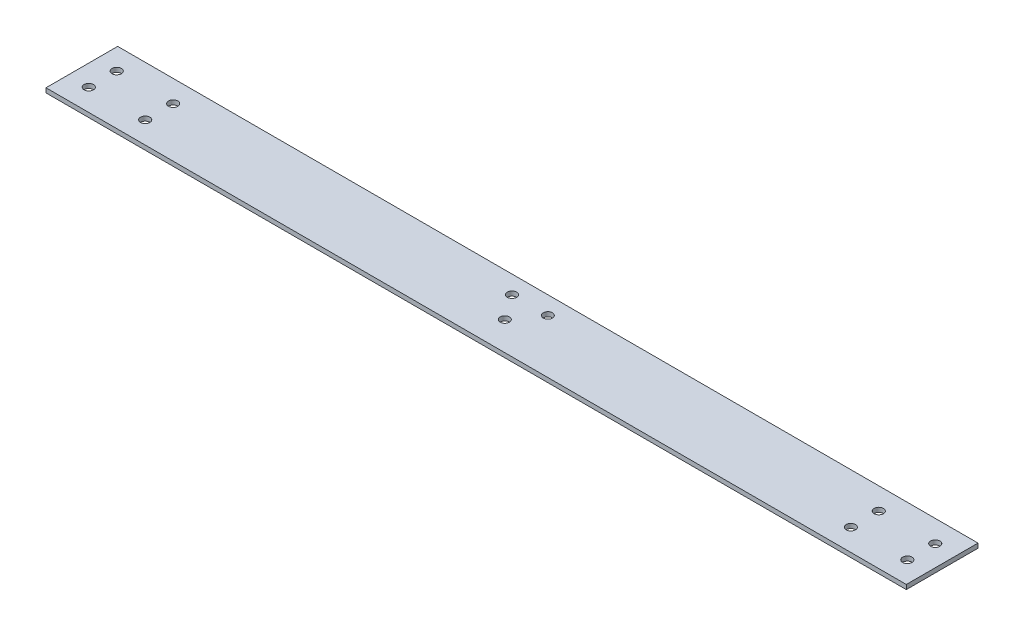
ISO-10303-21;
HEADER;
FILE_DESCRIPTION(('STEP AP214'),'2;1');
FILE_NAME('part.step','',(''),(''),'','','');
FILE_SCHEMA(('AUTOMOTIVE_DESIGN { 1 0 10303 214 1 1 1 1 }'));
ENDSEC;
DATA;
#1=APPLICATION_CONTEXT('core data for automotive mechanical design processes');
#2=APPLICATION_PROTOCOL_DEFINITION('international standard','automotive_design',2000,#1);
#3=PRODUCT_CONTEXT('',#1,'mechanical');
#4=PRODUCT('Part','Part','',(#3));
#5=PRODUCT_RELATED_PRODUCT_CATEGORY('part','',(#4));
#6=PRODUCT_DEFINITION_FORMATION('','',#4);
#7=PRODUCT_DEFINITION_CONTEXT('part definition',#1,'design');
#8=PRODUCT_DEFINITION('design','',#6,#7);
#9=PRODUCT_DEFINITION_SHAPE('','',#8);
#10=(LENGTH_UNIT() NAMED_UNIT(*) SI_UNIT(.MILLI.,.METRE.));
#11=(NAMED_UNIT(*) PLANE_ANGLE_UNIT() SI_UNIT($,.RADIAN.));
#12=(NAMED_UNIT(*) SI_UNIT($,.STERADIAN.) SOLID_ANGLE_UNIT());
#13=UNCERTAINTY_MEASURE_WITH_UNIT(LENGTH_MEASURE(1.E-05),#10,'distance_accuracy_value','');
#14=(GEOMETRIC_REPRESENTATION_CONTEXT(3) GLOBAL_UNCERTAINTY_ASSIGNED_CONTEXT((#13)) GLOBAL_UNIT_ASSIGNED_CONTEXT((#10,
#11,#12)) REPRESENTATION_CONTEXT('',''));
#15=CARTESIAN_POINT('',(0.,0.,0.));
#16=DIRECTION('',(0.,0.,1.));
#17=DIRECTION('',(1.,0.,0.));
#18=AXIS2_PLACEMENT_3D('',#15,#16,#17);
#19=CARTESIAN_POINT('',(0.,1.5875,0.));
#20=DIRECTION('',(0.,1.,0.));
#21=DIRECTION('',(0.,0.,1.));
#22=AXIS2_PLACEMENT_3D('',#19,#20,#21);
#23=PLANE('',#22);
#24=CARTESIAN_POINT('',(12.7,1.5875,-12.7));
#25=DIRECTION('',(0.,1.,0.));
#26=DIRECTION('',(0.,0.,1.));
#27=AXIS2_PLACEMENT_3D('',#24,#25,#26);
#28=CIRCLE('',#27,3.2639);
#29=CARTESIAN_POINT('',(12.7,1.5875,-9.43609999999999));
#30=VERTEX_POINT('',#29);
#31=EDGE_CURVE('E171',#30,#30,#28,.T.);
#32=ORIENTED_EDGE('',*,*,#31,.F.);
#33=EDGE_LOOP('',(#32));
#34=FACE_BOUND('',#33,.T.);
#35=CARTESIAN_POINT('',(0.,1.5875,5.08));
#36=DIRECTION('',(0.,1.,0.));
#37=DIRECTION('',(0.,0.,1.));
#38=AXIS2_PLACEMENT_3D('',#35,#36,#37);
#39=CIRCLE('',#38,3.2639);
#40=CARTESIAN_POINT('',(0.,1.5875,8.3439));
#41=VERTEX_POINT('',#40);
#42=EDGE_CURVE('E165',#41,#41,#39,.T.);
#43=ORIENTED_EDGE('',*,*,#42,.F.);
#44=EDGE_LOOP('',(#43));
#45=FACE_BOUND('',#44,.T.);
#46=CARTESIAN_POINT('',(-12.7,1.5875,-12.7));
#47=DIRECTION('',(0.,1.,0.));
#48=DIRECTION('',(0.,0.,1.));
#49=AXIS2_PLACEMENT_3D('',#46,#47,#48);
#50=CIRCLE('',#49,3.2639);
#51=CARTESIAN_POINT('',(-12.7,1.5875,-9.43609999999999));
#52=VERTEX_POINT('',#51);
#53=EDGE_CURVE('E159',#52,#52,#50,.T.);
#54=ORIENTED_EDGE('',*,*,#53,.F.);
#55=EDGE_LOOP('',(#54));
#56=FACE_BOUND('',#55,.T.);
#57=CARTESIAN_POINT('',(250.,1.5875,9.90000000000001));
#58=DIRECTION('',(0.,1.,0.));
#59=DIRECTION('',(0.,0.,1.));
#60=AXIS2_PLACEMENT_3D('',#57,#58,#59);
#61=CIRCLE('',#60,3.30000000000003);
#62=CARTESIAN_POINT('',(250.,1.5875,13.2));
#63=VERTEX_POINT('',#62);
#64=EDGE_CURVE('E144',#63,#63,#61,.T.);
#65=ORIENTED_EDGE('',*,*,#64,.F.);
#66=EDGE_LOOP('',(#65));
#67=FACE_BOUND('',#66,.T.);
#68=CARTESIAN_POINT('',(290.,1.5875,9.89999999999998));
#69=DIRECTION('',(0.,1.,0.));
#70=DIRECTION('',(0.,0.,-1.));
#71=AXIS2_PLACEMENT_3D('',#68,#69,#70);
#72=CIRCLE('',#71,3.30000000000003);
#73=CARTESIAN_POINT('',(290.,1.5875,6.59999999999994));
#74=VERTEX_POINT('',#73);
#75=EDGE_CURVE('E132',#74,#74,#72,.T.);
#76=ORIENTED_EDGE('',*,*,#75,.F.);
#77=EDGE_LOOP('',(#76));
#78=FACE_BOUND('',#77,.T.);
#79=CARTESIAN_POINT('',(-290.,1.5875,-9.90000000000002));
#80=DIRECTION('',(0.,1.,0.));
#81=DIRECTION('',(0.,0.,1.));
#82=AXIS2_PLACEMENT_3D('',#79,#80,#81);
#83=CIRCLE('',#82,3.30000000000003);
#84=CARTESIAN_POINT('',(-290.,1.5875,-6.59999999999999));
#85=VERTEX_POINT('',#84);
#86=EDGE_CURVE('E120',#85,#85,#83,.T.);
#87=ORIENTED_EDGE('',*,*,#86,.F.);
#88=EDGE_LOOP('',(#87));
#89=FACE_BOUND('',#88,.T.);
#90=CARTESIAN_POINT('',(-250.,1.5875,-9.89999999999998));
#91=DIRECTION('',(0.,1.,0.));
#92=DIRECTION('',(0.,0.,1.));
#93=AXIS2_PLACEMENT_3D('',#90,#91,#92);
#94=CIRCLE('',#93,3.30000000000003);
#95=CARTESIAN_POINT('',(-250.,1.5875,-6.59999999999995));
#96=VERTEX_POINT('',#95);
#97=EDGE_CURVE('E99',#96,#96,#94,.T.);
#98=ORIENTED_EDGE('',*,*,#97,.F.);
#99=EDGE_LOOP('',(#98));
#100=FACE_BOUND('',#99,.T.);
#101=DIRECTION('',(0.,0.,-1.));
#102=VECTOR('',#101,1.);
#103=CARTESIAN_POINT('',(304.8,1.5875,-25.4));
#104=LINE('',#103,#102);
#105=CARTESIAN_POINT('',(304.8,1.5875,25.4));
#106=VERTEX_POINT('',#105);
#107=CARTESIAN_POINT('',(304.8,1.5875,-25.4));
#108=VERTEX_POINT('',#107);
#109=EDGE_CURVE('E84',#106,#108,#104,.T.);
#110=ORIENTED_EDGE('',*,*,#109,.T.);
#111=DIRECTION('',(-1.,0.,0.));
#112=VECTOR('',#111,1.);
#113=CARTESIAN_POINT('',(-304.8,1.5875,-25.4));
#114=LINE('',#113,#112);
#115=CARTESIAN_POINT('',(-304.8,1.5875,-25.4));
#116=VERTEX_POINT('',#115);
#117=EDGE_CURVE('E79',#108,#116,#114,.T.);
#118=ORIENTED_EDGE('',*,*,#117,.T.);
#119=DIRECTION('',(0.,0.,1.));
#120=VECTOR('',#119,1.);
#121=CARTESIAN_POINT('',(-304.8,1.5875,-25.4));
#122=LINE('',#121,#120);
#123=CARTESIAN_POINT('',(-304.8,1.5875,25.4));
#124=VERTEX_POINT('',#123);
#125=EDGE_CURVE('E82',#116,#124,#122,.T.);
#126=ORIENTED_EDGE('',*,*,#125,.T.);
#127=DIRECTION('',(1.,0.,0.));
#128=VECTOR('',#127,1.);
#129=CARTESIAN_POINT('',(-304.8,1.5875,25.4));
#130=LINE('',#129,#128);
#131=EDGE_CURVE('E49',#124,#106,#130,.T.);
#132=ORIENTED_EDGE('',*,*,#131,.T.);
#133=EDGE_LOOP('',(#110,#118,#126,#132));
#134=FACE_BOUND('',#133,.T.);
#135=CARTESIAN_POINT('',(-250.,1.5875,9.90000000000002));
#136=DIRECTION('',(0.,1.,0.));
#137=DIRECTION('',(0.,0.,-1.));
#138=AXIS2_PLACEMENT_3D('',#135,#136,#137);
#139=CIRCLE('',#138,3.30000000000003);
#140=CARTESIAN_POINT('',(-250.,1.5875,6.59999999999998));
#141=VERTEX_POINT('',#140);
#142=EDGE_CURVE('E114',#141,#141,#139,.T.);
#143=ORIENTED_EDGE('',*,*,#142,.F.);
#144=EDGE_LOOP('',(#143));
#145=FACE_BOUND('',#144,.T.);
#146=CARTESIAN_POINT('',(-290.,1.5875,9.89999999999998));
#147=DIRECTION('',(0.,1.,0.));
#148=DIRECTION('',(0.,0.,1.));
#149=AXIS2_PLACEMENT_3D('',#146,#147,#148);
#150=CIRCLE('',#149,3.30000000000003);
#151=CARTESIAN_POINT('',(-290.,1.5875,13.2));
#152=VERTEX_POINT('',#151);
#153=EDGE_CURVE('E126',#152,#152,#150,.T.);
#154=ORIENTED_EDGE('',*,*,#153,.F.);
#155=EDGE_LOOP('',(#154));
#156=FACE_BOUND('',#155,.T.);
#157=CARTESIAN_POINT('',(290.,1.5875,-9.90000000000001));
#158=DIRECTION('',(0.,1.,0.));
#159=DIRECTION('',(0.,0.,-1.));
#160=AXIS2_PLACEMENT_3D('',#157,#158,#159);
#161=CIRCLE('',#160,3.30000000000003);
#162=CARTESIAN_POINT('',(290.,1.5875,-13.2));
#163=VERTEX_POINT('',#162);
#164=EDGE_CURVE('E138',#163,#163,#161,.T.);
#165=ORIENTED_EDGE('',*,*,#164,.F.);
#166=EDGE_LOOP('',(#165));
#167=FACE_BOUND('',#166,.T.);
#168=CARTESIAN_POINT('',(250.,1.5875,-9.89999999999998));
#169=DIRECTION('',(0.,1.,0.));
#170=DIRECTION('',(0.,0.,-1.));
#171=AXIS2_PLACEMENT_3D('',#168,#169,#170);
#172=CIRCLE('',#171,3.30000000000003);
#173=CARTESIAN_POINT('',(250.,1.5875,-13.2));
#174=VERTEX_POINT('',#173);
#175=EDGE_CURVE('E150',#174,#174,#172,.T.);
#176=ORIENTED_EDGE('',*,*,#175,.F.);
#177=EDGE_LOOP('',(#176));
#178=FACE_BOUND('',#177,.T.);
#179=ADVANCED_FACE('F32',(#34,#45,#56,#67,#78,#89,#100,#134,#145,#156,#167,#178),#23,.T.);
#180=CARTESIAN_POINT('',(0.,-1.5875,0.));
#181=DIRECTION('',(0.,1.,0.));
#182=DIRECTION('',(0.,0.,1.));
#183=AXIS2_PLACEMENT_3D('',#180,#181,#182);
#184=PLANE('',#183);
#185=CARTESIAN_POINT('',(12.7,-1.5875,-12.7));
#186=DIRECTION('',(0.,1.,0.));
#187=DIRECTION('',(0.,0.,1.));
#188=AXIS2_PLACEMENT_3D('',#185,#186,#187);
#189=CIRCLE('',#188,3.2639);
#190=CARTESIAN_POINT('',(12.7,-1.5875,-9.43609999999999));
#191=VERTEX_POINT('',#190);
#192=EDGE_CURVE('E162',#191,#191,#189,.T.);
#193=ORIENTED_EDGE('',*,*,#192,.T.);
#194=EDGE_LOOP('',(#193));
#195=FACE_BOUND('',#194,.T.);
#196=CARTESIAN_POINT('',(0.,-1.5875,5.08));
#197=DIRECTION('',(0.,1.,0.));
#198=DIRECTION('',(0.,0.,1.));
#199=AXIS2_PLACEMENT_3D('',#196,#197,#198);
#200=CIRCLE('',#199,3.2639);
#201=CARTESIAN_POINT('',(0.,-1.5875,8.3439));
#202=VERTEX_POINT('',#201);
#203=EDGE_CURVE('E168',#202,#202,#200,.T.);
#204=ORIENTED_EDGE('',*,*,#203,.T.);
#205=EDGE_LOOP('',(#204));
#206=FACE_BOUND('',#205,.T.);
#207=CARTESIAN_POINT('',(-12.7,-1.5875,-12.7));
#208=DIRECTION('',(0.,1.,0.));
#209=DIRECTION('',(0.,0.,1.));
#210=AXIS2_PLACEMENT_3D('',#207,#208,#209);
#211=CIRCLE('',#210,3.2639);
#212=CARTESIAN_POINT('',(-12.7,-1.5875,-9.43609999999999));
#213=VERTEX_POINT('',#212);
#214=EDGE_CURVE('E156',#213,#213,#211,.T.);
#215=ORIENTED_EDGE('',*,*,#214,.T.);
#216=EDGE_LOOP('',(#215));
#217=FACE_BOUND('',#216,.T.);
#218=DIRECTION('',(0.,0.,-1.));
#219=VECTOR('',#218,1.);
#220=CARTESIAN_POINT('',(304.8,-1.5875,-25.4));
#221=LINE('',#220,#219);
#222=CARTESIAN_POINT('',(304.8,-1.5875,25.4));
#223=VERTEX_POINT('',#222);
#224=CARTESIAN_POINT('',(304.8,-1.5875,-25.4));
#225=VERTEX_POINT('',#224);
#226=EDGE_CURVE('E96',#223,#225,#221,.T.);
#227=ORIENTED_EDGE('',*,*,#226,.F.);
#228=DIRECTION('',(1.,0.,0.));
#229=VECTOR('',#228,1.);
#230=CARTESIAN_POINT('',(-304.8,-1.5875,25.4));
#231=LINE('',#230,#229);
#232=CARTESIAN_POINT('',(-304.8,-1.5875,25.4));
#233=VERTEX_POINT('',#232);
#234=EDGE_CURVE('E72',#233,#223,#231,.T.);
#235=ORIENTED_EDGE('',*,*,#234,.F.);
#236=DIRECTION('',(0.,0.,1.));
#237=VECTOR('',#236,1.);
#238=CARTESIAN_POINT('',(-304.8,-1.5875,-25.4));
#239=LINE('',#238,#237);
#240=CARTESIAN_POINT('',(-304.8,-1.5875,-25.4));
#241=VERTEX_POINT('',#240);
#242=EDGE_CURVE('E66',#241,#233,#239,.T.);
#243=ORIENTED_EDGE('',*,*,#242,.F.);
#244=DIRECTION('',(-1.,0.,0.));
#245=VECTOR('',#244,1.);
#246=CARTESIAN_POINT('',(-304.8,-1.5875,-25.4));
#247=LINE('',#246,#245);
#248=EDGE_CURVE('E88',#225,#241,#247,.T.);
#249=ORIENTED_EDGE('',*,*,#248,.F.);
#250=EDGE_LOOP('',(#227,#235,#243,#249));
#251=FACE_BOUND('',#250,.T.);
#252=CARTESIAN_POINT('',(-250.,-1.5875,-9.89999999999998));
#253=DIRECTION('',(0.,1.,0.));
#254=DIRECTION('',(0.,0.,1.));
#255=AXIS2_PLACEMENT_3D('',#252,#253,#254);
#256=CIRCLE('',#255,3.30000000000003);
#257=CARTESIAN_POINT('',(-250.,-1.5875,-6.59999999999995));
#258=VERTEX_POINT('',#257);
#259=EDGE_CURVE('E111',#258,#258,#256,.T.);
#260=ORIENTED_EDGE('',*,*,#259,.T.);
#261=EDGE_LOOP('',(#260));
#262=FACE_BOUND('',#261,.T.);
#263=CARTESIAN_POINT('',(-250.,-1.5875,9.90000000000002));
#264=DIRECTION('',(0.,1.,0.));
#265=DIRECTION('',(0.,0.,-1.));
#266=AXIS2_PLACEMENT_3D('',#263,#264,#265);
#267=CIRCLE('',#266,3.30000000000003);
#268=CARTESIAN_POINT('',(-250.,-1.5875,6.59999999999998));
#269=VERTEX_POINT('',#268);
#270=EDGE_CURVE('E117',#269,#269,#267,.T.);
#271=ORIENTED_EDGE('',*,*,#270,.T.);
#272=EDGE_LOOP('',(#271));
#273=FACE_BOUND('',#272,.T.);
#274=CARTESIAN_POINT('',(-290.,-1.5875,-9.90000000000002));
#275=DIRECTION('',(0.,1.,0.));
#276=DIRECTION('',(0.,0.,1.));
#277=AXIS2_PLACEMENT_3D('',#274,#275,#276);
#278=CIRCLE('',#277,3.30000000000003);
#279=CARTESIAN_POINT('',(-290.,-1.5875,-6.59999999999999));
#280=VERTEX_POINT('',#279);
#281=EDGE_CURVE('E123',#280,#280,#278,.T.);
#282=ORIENTED_EDGE('',*,*,#281,.T.);
#283=EDGE_LOOP('',(#282));
#284=FACE_BOUND('',#283,.T.);
#285=CARTESIAN_POINT('',(-290.,-1.5875,9.89999999999998));
#286=DIRECTION('',(0.,1.,0.));
#287=DIRECTION('',(0.,0.,1.));
#288=AXIS2_PLACEMENT_3D('',#285,#286,#287);
#289=CIRCLE('',#288,3.30000000000003);
#290=CARTESIAN_POINT('',(-290.,-1.5875,13.2));
#291=VERTEX_POINT('',#290);
#292=EDGE_CURVE('E129',#291,#291,#289,.T.);
#293=ORIENTED_EDGE('',*,*,#292,.T.);
#294=EDGE_LOOP('',(#293));
#295=FACE_BOUND('',#294,.T.);
#296=CARTESIAN_POINT('',(290.,-1.5875,9.89999999999998));
#297=DIRECTION('',(0.,1.,0.));
#298=DIRECTION('',(0.,0.,-1.));
#299=AXIS2_PLACEMENT_3D('',#296,#297,#298);
#300=CIRCLE('',#299,3.30000000000003);
#301=CARTESIAN_POINT('',(290.,-1.5875,6.59999999999994));
#302=VERTEX_POINT('',#301);
#303=EDGE_CURVE('E135',#302,#302,#300,.T.);
#304=ORIENTED_EDGE('',*,*,#303,.T.);
#305=EDGE_LOOP('',(#304));
#306=FACE_BOUND('',#305,.T.);
#307=CARTESIAN_POINT('',(290.,-1.5875,-9.90000000000001));
#308=DIRECTION('',(0.,1.,0.));
#309=DIRECTION('',(0.,0.,-1.));
#310=AXIS2_PLACEMENT_3D('',#307,#308,#309);
#311=CIRCLE('',#310,3.30000000000003);
#312=CARTESIAN_POINT('',(290.,-1.5875,-13.2));
#313=VERTEX_POINT('',#312);
#314=EDGE_CURVE('E141',#313,#313,#311,.T.);
#315=ORIENTED_EDGE('',*,*,#314,.T.);
#316=EDGE_LOOP('',(#315));
#317=FACE_BOUND('',#316,.T.);
#318=CARTESIAN_POINT('',(250.,-1.5875,9.90000000000001));
#319=DIRECTION('',(0.,1.,0.));
#320=DIRECTION('',(0.,0.,1.));
#321=AXIS2_PLACEMENT_3D('',#318,#319,#320);
#322=CIRCLE('',#321,3.30000000000003);
#323=CARTESIAN_POINT('',(250.,-1.5875,13.2));
#324=VERTEX_POINT('',#323);
#325=EDGE_CURVE('E147',#324,#324,#322,.T.);
#326=ORIENTED_EDGE('',*,*,#325,.T.);
#327=EDGE_LOOP('',(#326));
#328=FACE_BOUND('',#327,.T.);
#329=CARTESIAN_POINT('',(250.,-1.5875,-9.89999999999998));
#330=DIRECTION('',(0.,1.,0.));
#331=DIRECTION('',(0.,0.,-1.));
#332=AXIS2_PLACEMENT_3D('',#329,#330,#331);
#333=CIRCLE('',#332,3.30000000000003);
#334=CARTESIAN_POINT('',(250.,-1.5875,-13.2));
#335=VERTEX_POINT('',#334);
#336=EDGE_CURVE('E153',#335,#335,#333,.T.);
#337=ORIENTED_EDGE('',*,*,#336,.T.);
#338=EDGE_LOOP('',(#337));
#339=FACE_BOUND('',#338,.T.);
#340=ADVANCED_FACE('F107',(#195,#206,#217,#251,#262,#273,#284,#295,#306,#317,#328,#339),#184,.F.);
#341=CARTESIAN_POINT('',(304.8,1.5875,-25.4));
#342=DIRECTION('',(-1.,0.,0.));
#343=DIRECTION('',(0.,0.,1.));
#344=AXIS2_PLACEMENT_3D('',#341,#342,#343);
#345=PLANE('',#344);
#346=ORIENTED_EDGE('',*,*,#226,.T.);
#347=DIRECTION('',(0.,-1.,0.));
#348=VECTOR('',#347,1.);
#349=CARTESIAN_POINT('',(304.8,1.5875,-25.4));
#350=LINE('',#349,#348);
#351=EDGE_CURVE('E11',#108,#225,#350,.T.);
#352=ORIENTED_EDGE('',*,*,#351,.F.);
#353=ORIENTED_EDGE('',*,*,#109,.F.);
#354=DIRECTION('',(0.,-1.,0.));
#355=VECTOR('',#354,1.);
#356=CARTESIAN_POINT('',(304.8,1.5875,25.4));
#357=LINE('',#356,#355);
#358=EDGE_CURVE('E92',#106,#223,#357,.T.);
#359=ORIENTED_EDGE('',*,*,#358,.T.);
#360=EDGE_LOOP('',(#346,#352,#353,#359));
#361=FACE_BOUND('',#360,.T.);
#362=ADVANCED_FACE('F34',(#361),#345,.F.);
#363=CARTESIAN_POINT('',(-304.8,1.5875,-25.4));
#364=DIRECTION('',(0.,0.,1.));
#365=DIRECTION('',(1.,0.,0.));
#366=AXIS2_PLACEMENT_3D('',#363,#364,#365);
#367=PLANE('',#366);
#368=ORIENTED_EDGE('',*,*,#248,.T.);
#369=DIRECTION('',(0.,-1.,0.));
#370=VECTOR('',#369,1.);
#371=CARTESIAN_POINT('',(-304.8,1.5875,-25.4));
#372=LINE('',#371,#370);
#373=EDGE_CURVE('E41',#116,#241,#372,.T.);
#374=ORIENTED_EDGE('',*,*,#373,.F.);
#375=ORIENTED_EDGE('',*,*,#117,.F.);
#376=ORIENTED_EDGE('',*,*,#351,.T.);
#377=EDGE_LOOP('',(#368,#374,#375,#376));
#378=FACE_BOUND('',#377,.T.);
#379=ADVANCED_FACE('F87',(#378),#367,.F.);
#380=CARTESIAN_POINT('',(-304.8,1.5875,-25.4));
#381=DIRECTION('',(1.,0.,0.));
#382=DIRECTION('',(0.,0.,-1.));
#383=AXIS2_PLACEMENT_3D('',#380,#381,#382);
#384=PLANE('',#383);
#385=ORIENTED_EDGE('',*,*,#242,.T.);
#386=DIRECTION('',(0.,-1.,0.));
#387=VECTOR('',#386,1.);
#388=CARTESIAN_POINT('',(-304.8,1.5875,25.4));
#389=LINE('',#388,#387);
#390=EDGE_CURVE('E89',#124,#233,#389,.T.);
#391=ORIENTED_EDGE('',*,*,#390,.F.);
#392=ORIENTED_EDGE('',*,*,#125,.F.);
#393=ORIENTED_EDGE('',*,*,#373,.T.);
#394=EDGE_LOOP('',(#385,#391,#392,#393));
#395=FACE_BOUND('',#394,.T.);
#396=ADVANCED_FACE('F90',(#395),#384,.F.);
#397=CARTESIAN_POINT('',(-304.8,1.5875,25.4));
#398=DIRECTION('',(0.,0.,-1.));
#399=DIRECTION('',(-1.,0.,0.));
#400=AXIS2_PLACEMENT_3D('',#397,#398,#399);
#401=PLANE('',#400);
#402=ORIENTED_EDGE('',*,*,#234,.T.);
#403=ORIENTED_EDGE('',*,*,#358,.F.);
#404=ORIENTED_EDGE('',*,*,#131,.F.);
#405=ORIENTED_EDGE('',*,*,#390,.T.);
#406=EDGE_LOOP('',(#402,#403,#404,#405));
#407=FACE_BOUND('',#406,.T.);
#408=ADVANCED_FACE('F104',(#407),#401,.F.);
#409=CARTESIAN_POINT('',(-250.,1.5875,-9.89999999999998));
#410=DIRECTION('',(0.,-1.,0.));
#411=DIRECTION('',(0.,0.,-1.));
#412=AXIS2_PLACEMENT_3D('',#409,#410,#411);
#413=CYLINDRICAL_SURFACE('',#412,3.30000000000003);
#414=ORIENTED_EDGE('',*,*,#97,.T.);
#415=EDGE_LOOP('',(#414));
#416=FACE_BOUND('',#415,.T.);
#417=ORIENTED_EDGE('',*,*,#259,.F.);
#418=EDGE_LOOP('',(#417));
#419=FACE_BOUND('',#418,.T.);
#420=ADVANCED_FACE('F201',(#416,#419),#413,.F.);
#421=CARTESIAN_POINT('',(-250.,1.5875,9.90000000000002));
#422=DIRECTION('',(0.,-1.,0.));
#423=DIRECTION('',(0.,0.,-1.));
#424=AXIS2_PLACEMENT_3D('',#421,#422,#423);
#425=CYLINDRICAL_SURFACE('',#424,3.30000000000003);
#426=ORIENTED_EDGE('',*,*,#142,.T.);
#427=EDGE_LOOP('',(#426));
#428=FACE_BOUND('',#427,.T.);
#429=ORIENTED_EDGE('',*,*,#270,.F.);
#430=EDGE_LOOP('',(#429));
#431=FACE_BOUND('',#430,.T.);
#432=ADVANCED_FACE('F204',(#428,#431),#425,.F.);
#433=CARTESIAN_POINT('',(-290.,1.5875,-9.90000000000002));
#434=DIRECTION('',(0.,-1.,0.));
#435=DIRECTION('',(0.,0.,-1.));
#436=AXIS2_PLACEMENT_3D('',#433,#434,#435);
#437=CYLINDRICAL_SURFACE('',#436,3.30000000000003);
#438=ORIENTED_EDGE('',*,*,#86,.T.);
#439=EDGE_LOOP('',(#438));
#440=FACE_BOUND('',#439,.T.);
#441=ORIENTED_EDGE('',*,*,#281,.F.);
#442=EDGE_LOOP('',(#441));
#443=FACE_BOUND('',#442,.T.);
#444=ADVANCED_FACE('F251',(#440,#443),#437,.F.);
#445=CARTESIAN_POINT('',(-290.,1.5875,9.89999999999998));
#446=DIRECTION('',(0.,-1.,0.));
#447=DIRECTION('',(0.,0.,-1.));
#448=AXIS2_PLACEMENT_3D('',#445,#446,#447);
#449=CYLINDRICAL_SURFACE('',#448,3.30000000000003);
#450=ORIENTED_EDGE('',*,*,#153,.T.);
#451=EDGE_LOOP('',(#450));
#452=FACE_BOUND('',#451,.T.);
#453=ORIENTED_EDGE('',*,*,#292,.F.);
#454=EDGE_LOOP('',(#453));
#455=FACE_BOUND('',#454,.T.);
#456=ADVANCED_FACE('F247',(#452,#455),#449,.F.);
#457=CARTESIAN_POINT('',(290.,1.5875,9.89999999999998));
#458=DIRECTION('',(0.,-1.,0.));
#459=DIRECTION('',(0.,0.,-1.));
#460=AXIS2_PLACEMENT_3D('',#457,#458,#459);
#461=CYLINDRICAL_SURFACE('',#460,3.30000000000003);
#462=ORIENTED_EDGE('',*,*,#75,.T.);
#463=EDGE_LOOP('',(#462));
#464=FACE_BOUND('',#463,.T.);
#465=ORIENTED_EDGE('',*,*,#303,.F.);
#466=EDGE_LOOP('',(#465));
#467=FACE_BOUND('',#466,.T.);
#468=ADVANCED_FACE('F243',(#464,#467),#461,.F.);
#469=CARTESIAN_POINT('',(290.,1.5875,-9.90000000000001));
#470=DIRECTION('',(0.,-1.,0.));
#471=DIRECTION('',(0.,0.,-1.));
#472=AXIS2_PLACEMENT_3D('',#469,#470,#471);
#473=CYLINDRICAL_SURFACE('',#472,3.30000000000003);
#474=ORIENTED_EDGE('',*,*,#164,.T.);
#475=EDGE_LOOP('',(#474));
#476=FACE_BOUND('',#475,.T.);
#477=ORIENTED_EDGE('',*,*,#314,.F.);
#478=EDGE_LOOP('',(#477));
#479=FACE_BOUND('',#478,.T.);
#480=ADVANCED_FACE('F236',(#476,#479),#473,.F.);
#481=CARTESIAN_POINT('',(250.,1.5875,9.90000000000001));
#482=DIRECTION('',(0.,-1.,0.));
#483=DIRECTION('',(0.,0.,-1.));
#484=AXIS2_PLACEMENT_3D('',#481,#482,#483);
#485=CYLINDRICAL_SURFACE('',#484,3.30000000000003);
#486=ORIENTED_EDGE('',*,*,#64,.T.);
#487=EDGE_LOOP('',(#486));
#488=FACE_BOUND('',#487,.T.);
#489=ORIENTED_EDGE('',*,*,#325,.F.);
#490=EDGE_LOOP('',(#489));
#491=FACE_BOUND('',#490,.T.);
#492=ADVANCED_FACE('F227',(#488,#491),#485,.F.);
#493=CARTESIAN_POINT('',(250.,1.5875,-9.89999999999998));
#494=DIRECTION('',(0.,-1.,0.));
#495=DIRECTION('',(0.,0.,-1.));
#496=AXIS2_PLACEMENT_3D('',#493,#494,#495);
#497=CYLINDRICAL_SURFACE('',#496,3.30000000000003);
#498=ORIENTED_EDGE('',*,*,#175,.T.);
#499=EDGE_LOOP('',(#498));
#500=FACE_BOUND('',#499,.T.);
#501=ORIENTED_EDGE('',*,*,#336,.F.);
#502=EDGE_LOOP('',(#501));
#503=FACE_BOUND('',#502,.T.);
#504=ADVANCED_FACE('F224',(#500,#503),#497,.F.);
#505=CARTESIAN_POINT('',(-12.7,-1.5875,-12.7));
#506=DIRECTION('',(0.,1.,0.));
#507=DIRECTION('',(0.,0.,1.));
#508=AXIS2_PLACEMENT_3D('',#505,#506,#507);
#509=CYLINDRICAL_SURFACE('',#508,3.2639);
#510=ORIENTED_EDGE('',*,*,#214,.F.);
#511=EDGE_LOOP('',(#510));
#512=FACE_BOUND('',#511,.T.);
#513=ORIENTED_EDGE('',*,*,#53,.T.);
#514=EDGE_LOOP('',(#513));
#515=FACE_BOUND('',#514,.T.);
#516=ADVANCED_FACE('F226',(#512,#515),#509,.F.);
#517=CARTESIAN_POINT('',(0.,-1.5875,5.08));
#518=DIRECTION('',(0.,1.,0.));
#519=DIRECTION('',(0.,0.,1.));
#520=AXIS2_PLACEMENT_3D('',#517,#518,#519);
#521=CYLINDRICAL_SURFACE('',#520,3.2639);
#522=ORIENTED_EDGE('',*,*,#203,.F.);
#523=EDGE_LOOP('',(#522));
#524=FACE_BOUND('',#523,.T.);
#525=ORIENTED_EDGE('',*,*,#42,.T.);
#526=EDGE_LOOP('',(#525));
#527=FACE_BOUND('',#526,.T.);
#528=ADVANCED_FACE('F182',(#524,#527),#521,.F.);
#529=CARTESIAN_POINT('',(12.7,-1.5875,-12.7));
#530=DIRECTION('',(0.,1.,0.));
#531=DIRECTION('',(0.,0.,1.));
#532=AXIS2_PLACEMENT_3D('',#529,#530,#531);
#533=CYLINDRICAL_SURFACE('',#532,3.2639);
#534=ORIENTED_EDGE('',*,*,#192,.F.);
#535=EDGE_LOOP('',(#534));
#536=FACE_BOUND('',#535,.T.);
#537=ORIENTED_EDGE('',*,*,#31,.T.);
#538=EDGE_LOOP('',(#537));
#539=FACE_BOUND('',#538,.T.);
#540=ADVANCED_FACE('F179',(#536,#539),#533,.F.);
#541=CLOSED_SHELL('',(#179,#340,#362,#379,#396,#408,#420,#432,#444,#456,#468,#480,#492,#504,
#516,#528,#540));
#542=MANIFOLD_SOLID_BREP('B2',#541);
#543=ADVANCED_BREP_SHAPE_REPRESENTATION('',(#18,#542),#14);
#544=SHAPE_DEFINITION_REPRESENTATION(#9,#543);
ENDSEC;
END-ISO-10303-21;
